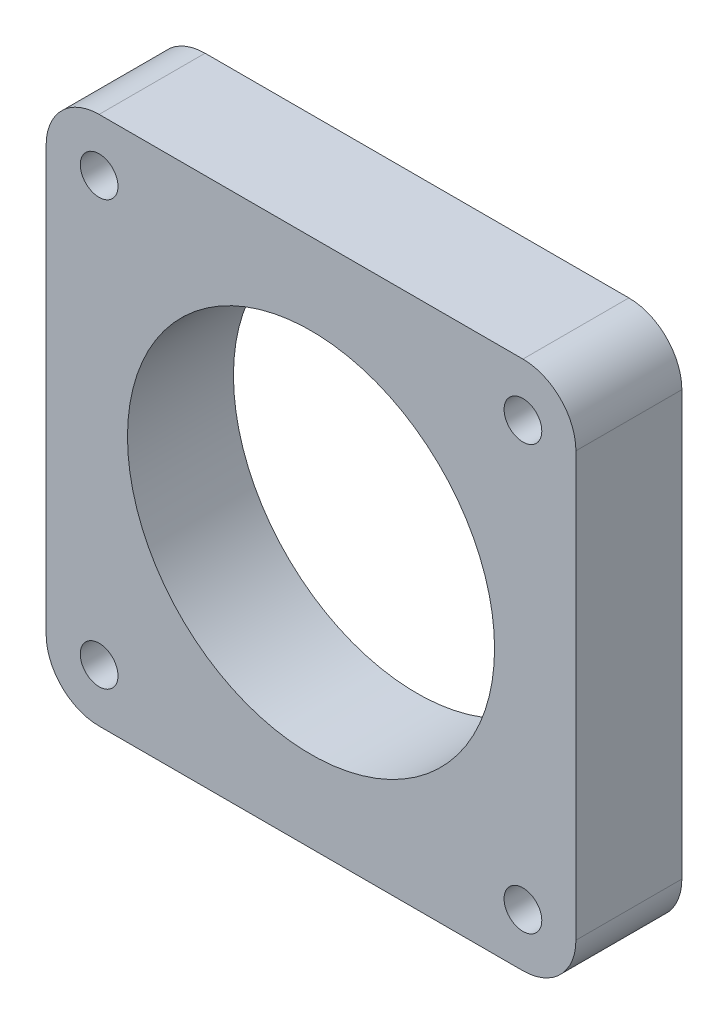
ISO-10303-21;
HEADER;
FILE_DESCRIPTION(('STEP AP214'),'2;1');
FILE_NAME('part.step','',(''),(''),'','','');
FILE_SCHEMA(('AUTOMOTIVE_DESIGN { 1 0 10303 214 1 1 1 1 }'));
ENDSEC;
DATA;
#1=APPLICATION_CONTEXT('core data for automotive mechanical design processes');
#2=APPLICATION_PROTOCOL_DEFINITION('international standard','automotive_design',2000,#1);
#3=PRODUCT_CONTEXT('',#1,'mechanical');
#4=PRODUCT('Part','Part','',(#3));
#5=PRODUCT_RELATED_PRODUCT_CATEGORY('part','',(#4));
#6=PRODUCT_DEFINITION_FORMATION('','',#4);
#7=PRODUCT_DEFINITION_CONTEXT('part definition',#1,'design');
#8=PRODUCT_DEFINITION('design','',#6,#7);
#9=PRODUCT_DEFINITION_SHAPE('','',#8);
#10=(LENGTH_UNIT() NAMED_UNIT(*) SI_UNIT(.MILLI.,.METRE.));
#11=(NAMED_UNIT(*) PLANE_ANGLE_UNIT() SI_UNIT($,.RADIAN.));
#12=(NAMED_UNIT(*) SI_UNIT($,.STERADIAN.) SOLID_ANGLE_UNIT());
#13=UNCERTAINTY_MEASURE_WITH_UNIT(LENGTH_MEASURE(1.E-05),#10,'distance_accuracy_value','');
#14=(GEOMETRIC_REPRESENTATION_CONTEXT(3) GLOBAL_UNCERTAINTY_ASSIGNED_CONTEXT((#13)) GLOBAL_UNIT_ASSIGNED_CONTEXT((#10,
#11,#12)) REPRESENTATION_CONTEXT('',''));
#15=CARTESIAN_POINT('',(0.,0.,0.));
#16=DIRECTION('',(0.,0.,1.));
#17=DIRECTION('',(1.,0.,0.));
#18=AXIS2_PLACEMENT_3D('',#15,#16,#17);
#19=CARTESIAN_POINT('',(0.,0.,6.35));
#20=DIRECTION('',(0.,0.,-1.));
#21=DIRECTION('',(-1.,0.,0.));
#22=AXIS2_PLACEMENT_3D('',#19,#20,#21);
#23=PLANE('',#22);
#24=DIRECTION('',(-1.,0.,0.));
#25=VECTOR('',#24,1.);
#26=CARTESIAN_POINT('',(-15.875,15.875,6.35));
#27=LINE('',#26,#25);
#28=CARTESIAN_POINT('',(12.7,15.875,6.35));
#29=VERTEX_POINT('',#28);
#30=CARTESIAN_POINT('',(-12.7,15.875,6.35));
#31=VERTEX_POINT('',#30);
#32=EDGE_CURVE('E136',#29,#31,#27,.T.);
#33=ORIENTED_EDGE('',*,*,#32,.T.);
#34=CARTESIAN_POINT('',(-12.7,12.7,6.35));
#35=DIRECTION('',(0.,0.,-1.));
#36=DIRECTION('',(-1.,0.,0.));
#37=AXIS2_PLACEMENT_3D('',#34,#35,#36);
#38=CIRCLE('',#37,3.175);
#39=CARTESIAN_POINT('',(-15.875,12.7,6.35));
#40=VERTEX_POINT('',#39);
#41=EDGE_CURVE('E155',#31,#40,#38,.F.);
#42=ORIENTED_EDGE('',*,*,#41,.T.);
#43=DIRECTION('',(0.,-1.,0.));
#44=VECTOR('',#43,1.);
#45=CARTESIAN_POINT('',(-15.875,-15.875,6.35));
#46=LINE('',#45,#44);
#47=CARTESIAN_POINT('',(-15.875,-12.7,6.35));
#48=VERTEX_POINT('',#47);
#49=EDGE_CURVE('E119',#40,#48,#46,.T.);
#50=ORIENTED_EDGE('',*,*,#49,.T.);
#51=CARTESIAN_POINT('',(-12.7,-12.7,6.35));
#52=DIRECTION('',(0.,0.,-1.));
#53=DIRECTION('',(-1.,0.,0.));
#54=AXIS2_PLACEMENT_3D('',#51,#52,#53);
#55=CIRCLE('',#54,3.175);
#56=CARTESIAN_POINT('',(-12.7,-15.875,6.35));
#57=VERTEX_POINT('',#56);
#58=EDGE_CURVE('E153',#48,#57,#55,.F.);
#59=ORIENTED_EDGE('',*,*,#58,.T.);
#60=DIRECTION('',(1.,0.,0.));
#61=VECTOR('',#60,1.);
#62=CARTESIAN_POINT('',(-15.875,-15.875,6.35));
#63=LINE('',#62,#61);
#64=CARTESIAN_POINT('',(12.7,-15.875,6.35));
#65=VERTEX_POINT('',#64);
#66=EDGE_CURVE('E166',#57,#65,#63,.T.);
#67=ORIENTED_EDGE('',*,*,#66,.T.);
#68=CARTESIAN_POINT('',(12.7,-12.7,6.35));
#69=DIRECTION('',(0.,0.,-1.));
#70=DIRECTION('',(-1.,0.,0.));
#71=AXIS2_PLACEMENT_3D('',#68,#69,#70);
#72=CIRCLE('',#71,3.175);
#73=CARTESIAN_POINT('',(15.875,-12.7,6.35));
#74=VERTEX_POINT('',#73);
#75=EDGE_CURVE('E54',#65,#74,#72,.F.);
#76=ORIENTED_EDGE('',*,*,#75,.T.);
#77=DIRECTION('',(0.,1.,0.));
#78=VECTOR('',#77,1.);
#79=CARTESIAN_POINT('',(15.875,-15.875,6.35));
#80=LINE('',#79,#78);
#81=CARTESIAN_POINT('',(15.875,12.7,6.35));
#82=VERTEX_POINT('',#81);
#83=EDGE_CURVE('E174',#74,#82,#80,.T.);
#84=ORIENTED_EDGE('',*,*,#83,.T.);
#85=CARTESIAN_POINT('',(12.7,12.7,6.35));
#86=DIRECTION('',(0.,0.,-1.));
#87=DIRECTION('',(-1.,0.,0.));
#88=AXIS2_PLACEMENT_3D('',#85,#86,#87);
#89=CIRCLE('',#88,3.175);
#90=EDGE_CURVE('E150',#82,#29,#89,.F.);
#91=ORIENTED_EDGE('',*,*,#90,.T.);
#92=EDGE_LOOP('',(#33,#42,#50,#59,#67,#76,#84,#91));
#93=FACE_BOUND('',#92,.T.);
#94=CARTESIAN_POINT('',(0.,0.,6.35));
#95=DIRECTION('',(0.,0.,1.));
#96=DIRECTION('',(1.,0.,0.));
#97=AXIS2_PLACEMENT_3D('',#94,#95,#96);
#98=CIRCLE('',#97,11.);
#99=CARTESIAN_POINT('',(11.,0.,6.35));
#100=VERTEX_POINT('',#99);
#101=EDGE_CURVE('E127',#100,#100,#98,.T.);
#102=ORIENTED_EDGE('',*,*,#101,.F.);
#103=EDGE_LOOP('',(#102));
#104=FACE_BOUND('',#103,.T.);
#105=CARTESIAN_POINT('',(-12.7,12.7,6.35));
#106=DIRECTION('',(0.,0.,1.));
#107=DIRECTION('',(1.,0.,0.));
#108=AXIS2_PLACEMENT_3D('',#105,#106,#107);
#109=CIRCLE('',#108,1.13030000000172);
#110=CARTESIAN_POINT('',(-11.5696999999983,12.7,6.35));
#111=VERTEX_POINT('',#110);
#112=EDGE_CURVE('E181',#111,#111,#109,.T.);
#113=ORIENTED_EDGE('',*,*,#112,.F.);
#114=EDGE_LOOP('',(#113));
#115=FACE_BOUND('',#114,.T.);
#116=CARTESIAN_POINT('',(-12.7,-12.7,6.35));
#117=DIRECTION('',(0.,0.,1.));
#118=DIRECTION('',(1.,0.,0.));
#119=AXIS2_PLACEMENT_3D('',#116,#117,#118);
#120=CIRCLE('',#119,1.13030000000172);
#121=CARTESIAN_POINT('',(-11.5696999999983,-12.7,6.35));
#122=VERTEX_POINT('',#121);
#123=EDGE_CURVE('E186',#122,#122,#120,.T.);
#124=ORIENTED_EDGE('',*,*,#123,.F.);
#125=EDGE_LOOP('',(#124));
#126=FACE_BOUND('',#125,.T.);
#127=CARTESIAN_POINT('',(12.7,-12.7,6.35));
#128=DIRECTION('',(0.,0.,1.));
#129=DIRECTION('',(1.,0.,0.));
#130=AXIS2_PLACEMENT_3D('',#127,#128,#129);
#131=CIRCLE('',#130,1.13030000000172);
#132=CARTESIAN_POINT('',(13.8303000000017,-12.7,6.35));
#133=VERTEX_POINT('',#132);
#134=EDGE_CURVE('E192',#133,#133,#131,.T.);
#135=ORIENTED_EDGE('',*,*,#134,.F.);
#136=EDGE_LOOP('',(#135));
#137=FACE_BOUND('',#136,.T.);
#138=CARTESIAN_POINT('',(12.7,12.7,6.35));
#139=DIRECTION('',(0.,0.,1.));
#140=DIRECTION('',(1.,0.,0.));
#141=AXIS2_PLACEMENT_3D('',#138,#139,#140);
#142=CIRCLE('',#141,1.13030000000172);
#143=CARTESIAN_POINT('',(13.8303000000017,12.7,6.35));
#144=VERTEX_POINT('',#143);
#145=EDGE_CURVE('E198',#144,#144,#142,.T.);
#146=ORIENTED_EDGE('',*,*,#145,.F.);
#147=EDGE_LOOP('',(#146));
#148=FACE_BOUND('',#147,.T.);
#149=ADVANCED_FACE('F33',(#93,#104,#115,#126,#137,#148),#23,.F.);
#150=CARTESIAN_POINT('',(0.,0.,0.));
#151=DIRECTION('',(0.,0.,-1.));
#152=DIRECTION('',(-1.,0.,0.));
#153=AXIS2_PLACEMENT_3D('',#150,#151,#152);
#154=PLANE('',#153);
#155=CARTESIAN_POINT('',(12.7,-12.7,0.));
#156=DIRECTION('',(0.,0.,1.));
#157=DIRECTION('',(1.,0.,0.));
#158=AXIS2_PLACEMENT_3D('',#155,#156,#157);
#159=CIRCLE('',#158,1.13030000000172);
#160=CARTESIAN_POINT('',(13.8303000000017,-12.7,0.));
#161=VERTEX_POINT('',#160);
#162=EDGE_CURVE('E195',#161,#161,#159,.T.);
#163=ORIENTED_EDGE('',*,*,#162,.T.);
#164=EDGE_LOOP('',(#163));
#165=FACE_BOUND('',#164,.T.);
#166=CARTESIAN_POINT('',(-12.7,12.7,0.));
#167=DIRECTION('',(0.,0.,1.));
#168=DIRECTION('',(1.,0.,0.));
#169=AXIS2_PLACEMENT_3D('',#166,#167,#168);
#170=CIRCLE('',#169,1.13030000000172);
#171=CARTESIAN_POINT('',(-11.5696999999983,12.7,0.));
#172=VERTEX_POINT('',#171);
#173=EDGE_CURVE('E183',#172,#172,#170,.T.);
#174=ORIENTED_EDGE('',*,*,#173,.T.);
#175=EDGE_LOOP('',(#174));
#176=FACE_BOUND('',#175,.T.);
#177=DIRECTION('',(0.,-1.,0.));
#178=VECTOR('',#177,1.);
#179=CARTESIAN_POINT('',(-15.875,-15.875,0.));
#180=LINE('',#179,#178);
#181=CARTESIAN_POINT('',(-15.875,12.7,0.));
#182=VERTEX_POINT('',#181);
#183=CARTESIAN_POINT('',(-15.875,-12.7,0.));
#184=VERTEX_POINT('',#183);
#185=EDGE_CURVE('E116',#182,#184,#180,.T.);
#186=ORIENTED_EDGE('',*,*,#185,.F.);
#187=CARTESIAN_POINT('',(-12.7,12.7,0.));
#188=DIRECTION('',(0.,0.,-1.));
#189=DIRECTION('',(-1.,0.,0.));
#190=AXIS2_PLACEMENT_3D('',#187,#188,#189);
#191=CIRCLE('',#190,3.175);
#192=CARTESIAN_POINT('',(-12.7,15.875,0.));
#193=VERTEX_POINT('',#192);
#194=EDGE_CURVE('E99',#182,#193,#191,.T.);
#195=ORIENTED_EDGE('',*,*,#194,.T.);
#196=DIRECTION('',(-1.,0.,0.));
#197=VECTOR('',#196,1.);
#198=CARTESIAN_POINT('',(-15.875,15.875,0.));
#199=LINE('',#198,#197);
#200=CARTESIAN_POINT('',(12.7,15.875,0.));
#201=VERTEX_POINT('',#200);
#202=EDGE_CURVE('E140',#201,#193,#199,.T.);
#203=ORIENTED_EDGE('',*,*,#202,.F.);
#204=CARTESIAN_POINT('',(12.7,12.7,0.));
#205=DIRECTION('',(0.,0.,-1.));
#206=DIRECTION('',(-1.,0.,0.));
#207=AXIS2_PLACEMENT_3D('',#204,#205,#206);
#208=CIRCLE('',#207,3.175);
#209=CARTESIAN_POINT('',(15.875,12.7,0.));
#210=VERTEX_POINT('',#209);
#211=EDGE_CURVE('E120',#201,#210,#208,.T.);
#212=ORIENTED_EDGE('',*,*,#211,.T.);
#213=DIRECTION('',(0.,1.,0.));
#214=VECTOR('',#213,1.);
#215=CARTESIAN_POINT('',(15.875,-15.875,0.));
#216=LINE('',#215,#214);
#217=CARTESIAN_POINT('',(15.875,-12.7,0.));
#218=VERTEX_POINT('',#217);
#219=EDGE_CURVE('E130',#218,#210,#216,.T.);
#220=ORIENTED_EDGE('',*,*,#219,.F.);
#221=CARTESIAN_POINT('',(12.7,-12.7,0.));
#222=DIRECTION('',(0.,0.,-1.));
#223=DIRECTION('',(-1.,0.,0.));
#224=AXIS2_PLACEMENT_3D('',#221,#222,#223);
#225=CIRCLE('',#224,3.175);
#226=CARTESIAN_POINT('',(12.7,-15.875,0.));
#227=VERTEX_POINT('',#226);
#228=EDGE_CURVE('E144',#218,#227,#225,.T.);
#229=ORIENTED_EDGE('',*,*,#228,.T.);
#230=DIRECTION('',(1.,0.,0.));
#231=VECTOR('',#230,1.);
#232=CARTESIAN_POINT('',(-15.875,-15.875,0.));
#233=LINE('',#232,#231);
#234=CARTESIAN_POINT('',(-12.7,-15.875,0.));
#235=VERTEX_POINT('',#234);
#236=EDGE_CURVE('E126',#235,#227,#233,.T.);
#237=ORIENTED_EDGE('',*,*,#236,.F.);
#238=CARTESIAN_POINT('',(-12.7,-12.7,0.));
#239=DIRECTION('',(0.,0.,-1.));
#240=DIRECTION('',(-1.,0.,0.));
#241=AXIS2_PLACEMENT_3D('',#238,#239,#240);
#242=CIRCLE('',#241,3.175);
#243=EDGE_CURVE('E110',#235,#184,#242,.T.);
#244=ORIENTED_EDGE('',*,*,#243,.T.);
#245=EDGE_LOOP('',(#186,#195,#203,#212,#220,#229,#237,#244));
#246=FACE_BOUND('',#245,.T.);
#247=CARTESIAN_POINT('',(0.,0.,0.));
#248=DIRECTION('',(0.,0.,1.));
#249=DIRECTION('',(1.,0.,0.));
#250=AXIS2_PLACEMENT_3D('',#247,#248,#249);
#251=CIRCLE('',#250,11.);
#252=CARTESIAN_POINT('',(11.,0.,0.));
#253=VERTEX_POINT('',#252);
#254=EDGE_CURVE('E133',#253,#253,#251,.T.);
#255=ORIENTED_EDGE('',*,*,#254,.T.);
#256=EDGE_LOOP('',(#255));
#257=FACE_BOUND('',#256,.T.);
#258=CARTESIAN_POINT('',(-12.7,-12.7,0.));
#259=DIRECTION('',(0.,0.,1.));
#260=DIRECTION('',(1.,0.,0.));
#261=AXIS2_PLACEMENT_3D('',#258,#259,#260);
#262=CIRCLE('',#261,1.13030000000172);
#263=CARTESIAN_POINT('',(-11.5696999999983,-12.7,0.));
#264=VERTEX_POINT('',#263);
#265=EDGE_CURVE('E189',#264,#264,#262,.T.);
#266=ORIENTED_EDGE('',*,*,#265,.T.);
#267=EDGE_LOOP('',(#266));
#268=FACE_BOUND('',#267,.T.);
#269=CARTESIAN_POINT('',(12.7,12.7,0.));
#270=DIRECTION('',(0.,0.,1.));
#271=DIRECTION('',(1.,0.,0.));
#272=AXIS2_PLACEMENT_3D('',#269,#270,#271);
#273=CIRCLE('',#272,1.13030000000172);
#274=CARTESIAN_POINT('',(13.8303000000017,12.7,0.));
#275=VERTEX_POINT('',#274);
#276=EDGE_CURVE('E201',#275,#275,#273,.T.);
#277=ORIENTED_EDGE('',*,*,#276,.T.);
#278=EDGE_LOOP('',(#277));
#279=FACE_BOUND('',#278,.T.);
#280=ADVANCED_FACE('F123',(#165,#176,#246,#257,#268,#279),#154,.T.);
#281=CARTESIAN_POINT('',(-15.875,-15.875,6.35));
#282=DIRECTION('',(1.,0.,0.));
#283=DIRECTION('',(0.,0.,-1.));
#284=AXIS2_PLACEMENT_3D('',#281,#282,#283);
#285=PLANE('',#284);
#286=ORIENTED_EDGE('',*,*,#49,.F.);
#287=DIRECTION('',(0.,0.,-1.));
#288=VECTOR('',#287,1.);
#289=CARTESIAN_POINT('',(-15.875,12.7,6.35));
#290=LINE('',#289,#288);
#291=EDGE_CURVE('E103',#40,#182,#290,.T.);
#292=ORIENTED_EDGE('',*,*,#291,.T.);
#293=ORIENTED_EDGE('',*,*,#185,.T.);
#294=DIRECTION('',(0.,0.,-1.));
#295=VECTOR('',#294,1.);
#296=CARTESIAN_POINT('',(-15.875,-12.7,6.35));
#297=LINE('',#296,#295);
#298=EDGE_CURVE('E121',#184,#48,#297,.F.);
#299=ORIENTED_EDGE('',*,*,#298,.T.);
#300=EDGE_LOOP('',(#286,#292,#293,#299));
#301=FACE_BOUND('',#300,.T.);
#302=ADVANCED_FACE('F115',(#301),#285,.F.);
#303=CARTESIAN_POINT('',(-15.875,-15.875,6.35));
#304=DIRECTION('',(0.,1.,0.));
#305=DIRECTION('',(-1.,0.,0.));
#306=AXIS2_PLACEMENT_3D('',#303,#304,#305);
#307=PLANE('',#306);
#308=ORIENTED_EDGE('',*,*,#66,.F.);
#309=DIRECTION('',(0.,0.,-1.));
#310=VECTOR('',#309,1.);
#311=CARTESIAN_POINT('',(-12.7,-15.875,6.35));
#312=LINE('',#311,#310);
#313=EDGE_CURVE('E159',#57,#235,#312,.T.);
#314=ORIENTED_EDGE('',*,*,#313,.T.);
#315=ORIENTED_EDGE('',*,*,#236,.T.);
#316=DIRECTION('',(0.,0.,-1.));
#317=VECTOR('',#316,1.);
#318=CARTESIAN_POINT('',(12.7,-15.875,6.35));
#319=LINE('',#318,#317);
#320=EDGE_CURVE('E157',#227,#65,#319,.F.);
#321=ORIENTED_EDGE('',*,*,#320,.T.);
#322=EDGE_LOOP('',(#308,#314,#315,#321));
#323=FACE_BOUND('',#322,.T.);
#324=ADVANCED_FACE('F164',(#323),#307,.F.);
#325=CARTESIAN_POINT('',(15.875,-15.875,6.35));
#326=DIRECTION('',(-1.,0.,0.));
#327=DIRECTION('',(0.,0.,1.));
#328=AXIS2_PLACEMENT_3D('',#325,#326,#327);
#329=PLANE('',#328);
#330=ORIENTED_EDGE('',*,*,#83,.F.);
#331=DIRECTION('',(0.,0.,-1.));
#332=VECTOR('',#331,1.);
#333=CARTESIAN_POINT('',(15.875,-12.7,6.35));
#334=LINE('',#333,#332);
#335=EDGE_CURVE('E11',#74,#218,#334,.T.);
#336=ORIENTED_EDGE('',*,*,#335,.T.);
#337=ORIENTED_EDGE('',*,*,#219,.T.);
#338=DIRECTION('',(0.,0.,-1.));
#339=VECTOR('',#338,1.);
#340=CARTESIAN_POINT('',(15.875,12.7,6.35));
#341=LINE('',#340,#339);
#342=EDGE_CURVE('E41',#210,#82,#341,.F.);
#343=ORIENTED_EDGE('',*,*,#342,.T.);
#344=EDGE_LOOP('',(#330,#336,#337,#343));
#345=FACE_BOUND('',#344,.T.);
#346=ADVANCED_FACE('F173',(#345),#329,.F.);
#347=CARTESIAN_POINT('',(-15.875,15.875,6.35));
#348=DIRECTION('',(0.,-1.,0.));
#349=DIRECTION('',(1.,0.,0.));
#350=AXIS2_PLACEMENT_3D('',#347,#348,#349);
#351=PLANE('',#350);
#352=ORIENTED_EDGE('',*,*,#202,.T.);
#353=DIRECTION('',(0.,0.,-1.));
#354=VECTOR('',#353,1.);
#355=CARTESIAN_POINT('',(-12.7,15.875,6.35));
#356=LINE('',#355,#354);
#357=EDGE_CURVE('E104',#193,#31,#356,.F.);
#358=ORIENTED_EDGE('',*,*,#357,.T.);
#359=ORIENTED_EDGE('',*,*,#32,.F.);
#360=DIRECTION('',(0.,0.,-1.));
#361=VECTOR('',#360,1.);
#362=CARTESIAN_POINT('',(12.7,15.875,6.35));
#363=LINE('',#362,#361);
#364=EDGE_CURVE('E109',#29,#201,#363,.T.);
#365=ORIENTED_EDGE('',*,*,#364,.T.);
#366=EDGE_LOOP('',(#352,#358,#359,#365));
#367=FACE_BOUND('',#366,.T.);
#368=ADVANCED_FACE('F222',(#367),#351,.F.);
#369=CARTESIAN_POINT('',(0.,0.,6.35));
#370=DIRECTION('',(0.,0.,-1.));
#371=DIRECTION('',(-1.,0.,0.));
#372=AXIS2_PLACEMENT_3D('',#369,#370,#371);
#373=CYLINDRICAL_SURFACE('',#372,11.);
#374=ORIENTED_EDGE('',*,*,#101,.T.);
#375=EDGE_LOOP('',(#374));
#376=FACE_BOUND('',#375,.T.);
#377=ORIENTED_EDGE('',*,*,#254,.F.);
#378=EDGE_LOOP('',(#377));
#379=FACE_BOUND('',#378,.T.);
#380=ADVANCED_FACE('F219',(#376,#379),#373,.F.);
#381=CARTESIAN_POINT('',(-12.7,12.7,6.35));
#382=DIRECTION('',(0.,0.,-1.));
#383=DIRECTION('',(-1.,0.,0.));
#384=AXIS2_PLACEMENT_3D('',#381,#382,#383);
#385=CYLINDRICAL_SURFACE('',#384,1.13030000000172);
#386=ORIENTED_EDGE('',*,*,#112,.T.);
#387=EDGE_LOOP('',(#386));
#388=FACE_BOUND('',#387,.T.);
#389=ORIENTED_EDGE('',*,*,#173,.F.);
#390=EDGE_LOOP('',(#389));
#391=FACE_BOUND('',#390,.T.);
#392=ADVANCED_FACE('F325',(#388,#391),#385,.F.);
#393=CARTESIAN_POINT('',(-12.7,-12.7,6.35));
#394=DIRECTION('',(0.,0.,-1.));
#395=DIRECTION('',(-1.,0.,0.));
#396=AXIS2_PLACEMENT_3D('',#393,#394,#395);
#397=CYLINDRICAL_SURFACE('',#396,1.13030000000172);
#398=ORIENTED_EDGE('',*,*,#123,.T.);
#399=EDGE_LOOP('',(#398));
#400=FACE_BOUND('',#399,.T.);
#401=ORIENTED_EDGE('',*,*,#265,.F.);
#402=EDGE_LOOP('',(#401));
#403=FACE_BOUND('',#402,.T.);
#404=ADVANCED_FACE('F315',(#400,#403),#397,.F.);
#405=CARTESIAN_POINT('',(12.7,-12.7,6.35));
#406=DIRECTION('',(0.,0.,-1.));
#407=DIRECTION('',(-1.,0.,0.));
#408=AXIS2_PLACEMENT_3D('',#405,#406,#407);
#409=CYLINDRICAL_SURFACE('',#408,1.13030000000172);
#410=ORIENTED_EDGE('',*,*,#134,.T.);
#411=EDGE_LOOP('',(#410));
#412=FACE_BOUND('',#411,.T.);
#413=ORIENTED_EDGE('',*,*,#162,.F.);
#414=EDGE_LOOP('',(#413));
#415=FACE_BOUND('',#414,.T.);
#416=ADVANCED_FACE('F306',(#412,#415),#409,.F.);
#417=CARTESIAN_POINT('',(12.7,12.7,6.35));
#418=DIRECTION('',(0.,0.,-1.));
#419=DIRECTION('',(-1.,0.,0.));
#420=AXIS2_PLACEMENT_3D('',#417,#418,#419);
#421=CYLINDRICAL_SURFACE('',#420,1.13030000000172);
#422=ORIENTED_EDGE('',*,*,#145,.T.);
#423=EDGE_LOOP('',(#422));
#424=FACE_BOUND('',#423,.T.);
#425=ORIENTED_EDGE('',*,*,#276,.F.);
#426=EDGE_LOOP('',(#425));
#427=FACE_BOUND('',#426,.T.);
#428=ADVANCED_FACE('F207',(#424,#427),#421,.F.);
#429=CARTESIAN_POINT('',(-12.7,12.7,6.35));
#430=DIRECTION('',(0.,0.,-1.));
#431=DIRECTION('',(-1.,0.,0.));
#432=AXIS2_PLACEMENT_3D('',#429,#430,#431);
#433=CYLINDRICAL_SURFACE('',#432,3.175);
#434=ORIENTED_EDGE('',*,*,#41,.F.);
#435=ORIENTED_EDGE('',*,*,#357,.F.);
#436=ORIENTED_EDGE('',*,*,#194,.F.);
#437=ORIENTED_EDGE('',*,*,#291,.F.);
#438=EDGE_LOOP('',(#434,#435,#436,#437));
#439=FACE_BOUND('',#438,.T.);
#440=ADVANCED_FACE('F102',(#439),#433,.T.);
#441=CARTESIAN_POINT('',(-12.7,-12.7,6.35));
#442=DIRECTION('',(0.,0.,-1.));
#443=DIRECTION('',(-1.,0.,0.));
#444=AXIS2_PLACEMENT_3D('',#441,#442,#443);
#445=CYLINDRICAL_SURFACE('',#444,3.175);
#446=ORIENTED_EDGE('',*,*,#58,.F.);
#447=ORIENTED_EDGE('',*,*,#298,.F.);
#448=ORIENTED_EDGE('',*,*,#243,.F.);
#449=ORIENTED_EDGE('',*,*,#313,.F.);
#450=EDGE_LOOP('',(#446,#447,#448,#449));
#451=FACE_BOUND('',#450,.T.);
#452=ADVANCED_FACE('F234',(#451),#445,.T.);
#453=CARTESIAN_POINT('',(12.7,-12.7,6.35));
#454=DIRECTION('',(0.,0.,-1.));
#455=DIRECTION('',(-1.,0.,0.));
#456=AXIS2_PLACEMENT_3D('',#453,#454,#455);
#457=CYLINDRICAL_SURFACE('',#456,3.175);
#458=ORIENTED_EDGE('',*,*,#75,.F.);
#459=ORIENTED_EDGE('',*,*,#320,.F.);
#460=ORIENTED_EDGE('',*,*,#228,.F.);
#461=ORIENTED_EDGE('',*,*,#335,.F.);
#462=EDGE_LOOP('',(#458,#459,#460,#461));
#463=FACE_BOUND('',#462,.T.);
#464=ADVANCED_FACE('F172',(#463),#457,.T.);
#465=CARTESIAN_POINT('',(12.7,12.7,6.35));
#466=DIRECTION('',(0.,0.,-1.));
#467=DIRECTION('',(-1.,0.,0.));
#468=AXIS2_PLACEMENT_3D('',#465,#466,#467);
#469=CYLINDRICAL_SURFACE('',#468,3.175);
#470=ORIENTED_EDGE('',*,*,#90,.F.);
#471=ORIENTED_EDGE('',*,*,#342,.F.);
#472=ORIENTED_EDGE('',*,*,#211,.F.);
#473=ORIENTED_EDGE('',*,*,#364,.F.);
#474=EDGE_LOOP('',(#470,#471,#472,#473));
#475=FACE_BOUND('',#474,.T.);
#476=ADVANCED_FACE('F35',(#475),#469,.T.);
#477=CLOSED_SHELL('',(#149,#280,#302,#324,#346,#368,#380,#392,#404,#416,#428,#440,#452,#464,#476));
#478=MANIFOLD_SOLID_BREP('B2',#477);
#479=ADVANCED_BREP_SHAPE_REPRESENTATION('',(#18,#478),#14);
#480=SHAPE_DEFINITION_REPRESENTATION(#9,#479);
ENDSEC;
END-ISO-10303-21;
